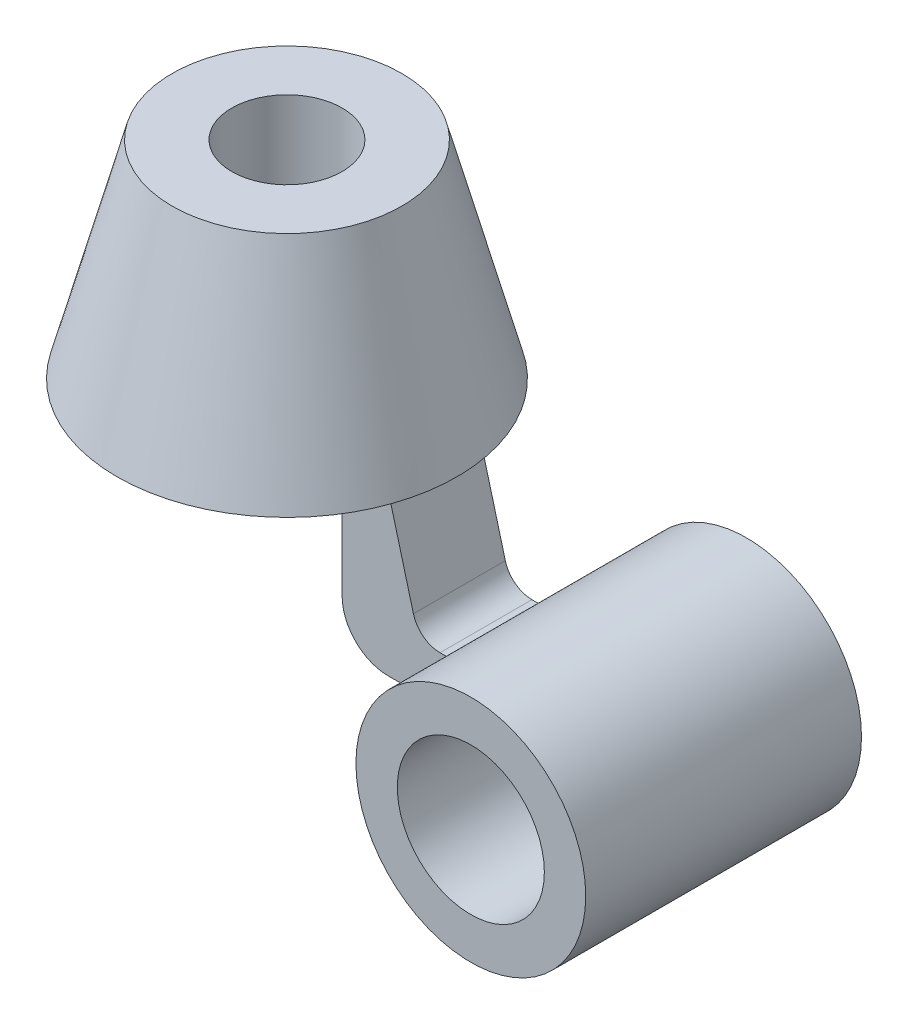
ISO-10303-21;
HEADER;
FILE_DESCRIPTION(('STEP AP214'),'2;1');
FILE_NAME('part.step','',(''),(''),'','','');
FILE_SCHEMA(('AUTOMOTIVE_DESIGN { 1 0 10303 214 1 1 1 1 }'));
ENDSEC;
DATA;
#1=APPLICATION_CONTEXT('core data for automotive mechanical design processes');
#2=APPLICATION_PROTOCOL_DEFINITION('international standard','automotive_design',2000,#1);
#3=PRODUCT_CONTEXT('',#1,'mechanical');
#4=PRODUCT('Part','Part','',(#3));
#5=PRODUCT_RELATED_PRODUCT_CATEGORY('part','',(#4));
#6=PRODUCT_DEFINITION_FORMATION('','',#4);
#7=PRODUCT_DEFINITION_CONTEXT('part definition',#1,'design');
#8=PRODUCT_DEFINITION('design','',#6,#7);
#9=PRODUCT_DEFINITION_SHAPE('','',#8);
#10=(LENGTH_UNIT() NAMED_UNIT(*) SI_UNIT(.MILLI.,.METRE.));
#11=(NAMED_UNIT(*) PLANE_ANGLE_UNIT() SI_UNIT($,.RADIAN.));
#12=(NAMED_UNIT(*) SI_UNIT($,.STERADIAN.) SOLID_ANGLE_UNIT());
#13=UNCERTAINTY_MEASURE_WITH_UNIT(LENGTH_MEASURE(1.E-05),#10,'distance_accuracy_value','');
#14=(GEOMETRIC_REPRESENTATION_CONTEXT(3) GLOBAL_UNCERTAINTY_ASSIGNED_CONTEXT((#13)) GLOBAL_UNIT_ASSIGNED_CONTEXT((#10,
#11,#12)) REPRESENTATION_CONTEXT('',''));
#15=CARTESIAN_POINT('',(0.,0.,0.));
#16=DIRECTION('',(0.,0.,1.));
#17=DIRECTION('',(1.,0.,0.));
#18=AXIS2_PLACEMENT_3D('',#15,#16,#17);
#19=CARTESIAN_POINT('',(22.,-35.,10.));
#20=DIRECTION('',(0.,1.,0.));
#21=DIRECTION('',(0.,0.,1.));
#22=AXIS2_PLACEMENT_3D('',#19,#20,#21);
#23=PLANE('',#22);
#24=DIRECTION('',(1.,0.,0.));
#25=VECTOR('',#24,1.);
#26=CARTESIAN_POINT('',(22.,-35.,10.));
#27=LINE('',#26,#25);
#28=CARTESIAN_POINT('',(32.,-35.,10.));
#29=VERTEX_POINT('',#28);
#30=CARTESIAN_POINT('',(45.,-35.,10.));
#31=VERTEX_POINT('',#30);
#32=EDGE_CURVE('E259',#29,#31,#27,.T.);
#33=ORIENTED_EDGE('',*,*,#32,.F.);
#34=DIRECTION('',(0.,0.,-1.));
#35=VECTOR('',#34,1.);
#36=CARTESIAN_POINT('',(32.,-35.,10.));
#37=LINE('',#36,#35);
#38=CARTESIAN_POINT('',(32.,-35.,-10.));
#39=VERTEX_POINT('',#38);
#40=EDGE_CURVE('E133',#29,#39,#37,.T.);
#41=ORIENTED_EDGE('',*,*,#40,.T.);
#42=DIRECTION('',(1.,0.,0.));
#43=VECTOR('',#42,1.);
#44=CARTESIAN_POINT('',(22.,-35.,-10.));
#45=LINE('',#44,#43);
#46=CARTESIAN_POINT('',(45.,-35.,-10.));
#47=VERTEX_POINT('',#46);
#48=EDGE_CURVE('E117',#39,#47,#45,.T.);
#49=ORIENTED_EDGE('',*,*,#48,.T.);
#50=DIRECTION('',(0.,0.,-1.));
#51=VECTOR('',#50,1.);
#52=CARTESIAN_POINT('',(45.,-35.,30.));
#53=LINE('',#52,#51);
#54=EDGE_CURVE('E126',#31,#47,#53,.T.);
#55=ORIENTED_EDGE('',*,*,#54,.F.);
#56=EDGE_LOOP('',(#33,#41,#49,#55));
#57=FACE_BOUND('',#56,.T.);
#58=ADVANCED_FACE('F45',(#57),#23,.F.);
#59=CARTESIAN_POINT('',(54.1887004621803,-25.,10.));
#60=DIRECTION('',(0.,-1.,0.));
#61=DIRECTION('',(1.,0.,0.));
#62=AXIS2_PLACEMENT_3D('',#59,#60,#61);
#63=PLANE('',#62);
#64=DIRECTION('',(-1.,0.,0.));
#65=VECTOR('',#64,1.);
#66=CARTESIAN_POINT('',(54.1887004621803,-25.,-10.));
#67=LINE('',#66,#65);
#68=CARTESIAN_POINT('',(47.0871215252208,-25.,-10.));
#69=VERTEX_POINT('',#68);
#70=CARTESIAN_POINT('',(43.3026917386517,-25.,-10.));
#71=VERTEX_POINT('',#70);
#72=EDGE_CURVE('E108',#69,#71,#67,.T.);
#73=ORIENTED_EDGE('',*,*,#72,.T.);
#74=DIRECTION('',(0.,0.,-1.));
#75=VECTOR('',#74,1.);
#76=CARTESIAN_POINT('',(43.3026917386517,-25.,10.));
#77=LINE('',#76,#75);
#78=CARTESIAN_POINT('',(43.3026917386517,-25.,10.));
#79=VERTEX_POINT('',#78);
#80=EDGE_CURVE('E61',#71,#79,#77,.F.);
#81=ORIENTED_EDGE('',*,*,#80,.T.);
#82=DIRECTION('',(-1.,0.,0.));
#83=VECTOR('',#82,1.);
#84=CARTESIAN_POINT('',(54.1887004621803,-25.,10.));
#85=LINE('',#84,#83);
#86=CARTESIAN_POINT('',(47.0871215252208,-25.,10.));
#87=VERTEX_POINT('',#86);
#88=EDGE_CURVE('E122',#87,#79,#85,.T.);
#89=ORIENTED_EDGE('',*,*,#88,.F.);
#90=DIRECTION('',(0.,0.,-1.));
#91=VECTOR('',#90,1.);
#92=CARTESIAN_POINT('',(47.0871215252208,-25.,30.));
#93=LINE('',#92,#91);
#94=EDGE_CURVE('E120',#69,#87,#93,.F.);
#95=ORIENTED_EDGE('',*,*,#94,.F.);
#96=EDGE_LOOP('',(#73,#81,#89,#95));
#97=FACE_BOUND('',#96,.T.);
#98=ADVANCED_FACE('F121',(#97),#63,.F.);
#99=CARTESIAN_POINT('',(0.,0.,0.));
#100=DIRECTION('',(0.,1.,0.));
#101=DIRECTION('',(0.,0.,1.));
#102=AXIS2_PLACEMENT_3D('',#99,#100,#101);
#103=PLANE('',#102);
#104=CARTESIAN_POINT('',(0.,0.,0.));
#105=DIRECTION('',(0.,1.,0.));
#106=DIRECTION('',(0.,0.,1.));
#107=AXIS2_PLACEMENT_3D('',#104,#105,#106);
#108=CIRCLE('',#107,12.);
#109=CARTESIAN_POINT('',(0.,0.,12.));
#110=VERTEX_POINT('',#109);
#111=EDGE_CURVE('E233',#110,#110,#108,.T.);
#112=ORIENTED_EDGE('',*,*,#111,.T.);
#113=EDGE_LOOP('',(#112));
#114=FACE_BOUND('',#113,.T.);
#115=DIRECTION('',(0.,0.,-1.));
#116=VECTOR('',#115,1.);
#117=CARTESIAN_POINT('',(22.,0.,10.));
#118=LINE('',#117,#116);
#119=CARTESIAN_POINT('',(22.,0.,10.));
#120=VERTEX_POINT('',#119);
#121=CARTESIAN_POINT('',(22.,0.,-10.));
#122=VERTEX_POINT('',#121);
#123=EDGE_CURVE('E184',#120,#122,#118,.T.);
#124=ORIENTED_EDGE('',*,*,#123,.F.);
#125=DIRECTION('',(-1.,0.,0.));
#126=VECTOR('',#125,1.);
#127=CARTESIAN_POINT('',(32.,0.,10.));
#128=LINE('',#127,#126);
#129=CARTESIAN_POINT('',(32.,0.,10.));
#130=VERTEX_POINT('',#129);
#131=EDGE_CURVE('E173',#130,#120,#128,.T.);
#132=ORIENTED_EDGE('',*,*,#131,.F.);
#133=DIRECTION('',(0.,0.,-1.));
#134=VECTOR('',#133,1.);
#135=CARTESIAN_POINT('',(32.,0.,10.));
#136=LINE('',#135,#134);
#137=CARTESIAN_POINT('',(32.,0.,-10.));
#138=VERTEX_POINT('',#137);
#139=EDGE_CURVE('E181',#130,#138,#136,.T.);
#140=ORIENTED_EDGE('',*,*,#139,.T.);
#141=DIRECTION('',(-1.,0.,0.));
#142=VECTOR('',#141,1.);
#143=CARTESIAN_POINT('',(32.,0.,-10.));
#144=LINE('',#143,#142);
#145=EDGE_CURVE('E171',#138,#122,#144,.T.);
#146=ORIENTED_EDGE('',*,*,#145,.T.);
#147=EDGE_LOOP('',(#124,#132,#140,#146));
#148=FACE_BOUND('',#147,.T.);
#149=CARTESIAN_POINT('',(0.,0.,0.));
#150=DIRECTION('',(0.,1.,0.));
#151=DIRECTION('',(0.,0.,1.));
#152=AXIS2_PLACEMENT_3D('',#149,#150,#151);
#153=CIRCLE('',#152,37.);
#154=CARTESIAN_POINT('',(0.,0.,37.));
#155=VERTEX_POINT('',#154);
#156=EDGE_CURVE('E134',#155,#155,#153,.T.);
#157=ORIENTED_EDGE('',*,*,#156,.F.);
#158=EDGE_LOOP('',(#157));
#159=FACE_BOUND('',#158,.T.);
#160=ADVANCED_FACE('F196',(#114,#148,#159),#103,.F.);
#161=CARTESIAN_POINT('',(0.,0.,0.));
#162=DIRECTION('',(0.,-1.,0.));
#163=DIRECTION('',(0.,0.,-1.));
#164=AXIS2_PLACEMENT_3D('',#161,#162,#163);
#165=CONICAL_SURFACE('',#164,37.,0.260602391747341);
#166=CARTESIAN_POINT('',(0.,45.,0.));
#167=DIRECTION('',(0.,1.,0.));
#168=DIRECTION('',(0.,0.,1.));
#169=AXIS2_PLACEMENT_3D('',#166,#167,#168);
#170=CIRCLE('',#169,25.);
#171=CARTESIAN_POINT('',(0.,45.,25.));
#172=VERTEX_POINT('',#171);
#173=EDGE_CURVE('E142',#172,#172,#170,.T.);
#174=ORIENTED_EDGE('',*,*,#173,.F.);
#175=EDGE_LOOP('',(#174));
#176=FACE_BOUND('',#175,.T.);
#177=ORIENTED_EDGE('',*,*,#156,.T.);
#178=EDGE_LOOP('',(#177));
#179=FACE_BOUND('',#178,.T.);
#180=ADVANCED_FACE('F193',(#176,#179),#165,.T.);
#181=CARTESIAN_POINT('',(25.,45.,0.));
#182=DIRECTION('',(0.,-1.,0.));
#183=DIRECTION('',(0.,0.,-1.));
#184=AXIS2_PLACEMENT_3D('',#181,#182,#183);
#185=PLANE('',#184);
#186=CARTESIAN_POINT('',(0.,45.,0.));
#187=DIRECTION('',(0.,1.,0.));
#188=DIRECTION('',(0.,0.,1.));
#189=AXIS2_PLACEMENT_3D('',#186,#187,#188);
#190=CIRCLE('',#189,12.);
#191=CARTESIAN_POINT('',(0.,45.,12.));
#192=VERTEX_POINT('',#191);
#193=EDGE_CURVE('E230',#192,#192,#190,.T.);
#194=ORIENTED_EDGE('',*,*,#193,.F.);
#195=EDGE_LOOP('',(#194));
#196=FACE_BOUND('',#195,.T.);
#197=ORIENTED_EDGE('',*,*,#173,.T.);
#198=EDGE_LOOP('',(#197));
#199=FACE_BOUND('',#198,.T.);
#200=ADVANCED_FACE('F191',(#196,#199),#185,.F.);
#201=CARTESIAN_POINT('',(22.,0.,10.));
#202=DIRECTION('',(1.,0.,0.));
#203=DIRECTION('',(0.,1.,0.));
#204=AXIS2_PLACEMENT_3D('',#201,#202,#203);
#205=PLANE('',#204);
#206=DIRECTION('',(0.,-1.,0.));
#207=VECTOR('',#206,1.);
#208=CARTESIAN_POINT('',(22.,0.,-10.));
#209=LINE('',#208,#207);
#210=CARTESIAN_POINT('',(22.,-25.,-10.));
#211=VERTEX_POINT('',#210);
#212=EDGE_CURVE('E268',#122,#211,#209,.T.);
#213=ORIENTED_EDGE('',*,*,#212,.T.);
#214=DIRECTION('',(0.,0.,-1.));
#215=VECTOR('',#214,1.);
#216=CARTESIAN_POINT('',(22.,-25.,10.));
#217=LINE('',#216,#215);
#218=CARTESIAN_POINT('',(22.,-25.,10.));
#219=VERTEX_POINT('',#218);
#220=EDGE_CURVE('E148',#211,#219,#217,.F.);
#221=ORIENTED_EDGE('',*,*,#220,.T.);
#222=DIRECTION('',(0.,-1.,0.));
#223=VECTOR('',#222,1.);
#224=CARTESIAN_POINT('',(22.,0.,10.));
#225=LINE('',#224,#223);
#226=EDGE_CURVE('E177',#120,#219,#225,.T.);
#227=ORIENTED_EDGE('',*,*,#226,.F.);
#228=ORIENTED_EDGE('',*,*,#123,.T.);
#229=EDGE_LOOP('',(#213,#221,#227,#228));
#230=FACE_BOUND('',#229,.T.);
#231=ADVANCED_FACE('F221',(#230),#205,.F.);
#232=CARTESIAN_POINT('',(38.6987298107779,-25.,10.));
#233=DIRECTION('',(-0.96592582628907,-0.258819045102515,0.));
#234=DIRECTION('',(0.258819045102515,-0.96592582628907,0.));
#235=AXIS2_PLACEMENT_3D('',#232,#233,#234);
#236=PLANE('',#235);
#237=DIRECTION('',(-0.258819045102515,0.96592582628907,0.));
#238=VECTOR('',#237,1.);
#239=CARTESIAN_POINT('',(38.6987298107779,-25.,10.));
#240=LINE('',#239,#238);
#241=CARTESIAN_POINT('',(37.5071367809173,-20.5529142706151,10.));
#242=VERTEX_POINT('',#241);
#243=EDGE_CURVE('E166',#242,#130,#240,.T.);
#244=ORIENTED_EDGE('',*,*,#243,.F.);
#245=DIRECTION('',(0.,0.,-1.));
#246=VECTOR('',#245,1.);
#247=CARTESIAN_POINT('',(37.5071367809173,-20.5529142706151,-10.));
#248=LINE('',#247,#246);
#249=CARTESIAN_POINT('',(37.5071367809173,-20.5529142706151,-10.));
#250=VERTEX_POINT('',#249);
#251=EDGE_CURVE('E154',#242,#250,#248,.T.);
#252=ORIENTED_EDGE('',*,*,#251,.T.);
#253=DIRECTION('',(-0.258819045102515,0.96592582628907,0.));
#254=VECTOR('',#253,1.);
#255=CARTESIAN_POINT('',(38.6987298107779,-25.,-10.));
#256=LINE('',#255,#254);
#257=EDGE_CURVE('E116',#250,#138,#256,.T.);
#258=ORIENTED_EDGE('',*,*,#257,.T.);
#259=ORIENTED_EDGE('',*,*,#139,.F.);
#260=EDGE_LOOP('',(#244,#252,#258,#259));
#261=FACE_BOUND('',#260,.T.);
#262=ADVANCED_FACE('F163',(#261),#236,.F.);
#263=CARTESIAN_POINT('',(0.,0.,10.));
#264=DIRECTION('',(0.,0.,1.));
#265=DIRECTION('',(1.,0.,0.));
#266=AXIS2_PLACEMENT_3D('',#263,#264,#265);
#267=PLANE('',#266);
#268=ORIENTED_EDGE('',*,*,#226,.T.);
#269=CARTESIAN_POINT('',(32.,-25.,10.));
#270=DIRECTION('',(0.,0.,1.));
#271=DIRECTION('',(1.,0.,0.));
#272=AXIS2_PLACEMENT_3D('',#269,#270,#271);
#273=CIRCLE('',#272,10.);
#274=EDGE_CURVE('E151',#219,#29,#273,.T.);
#275=ORIENTED_EDGE('',*,*,#274,.T.);
#276=ORIENTED_EDGE('',*,*,#32,.T.);
#277=CARTESIAN_POINT('',(70.,-35.,10.));
#278=DIRECTION('',(0.,0.,1.));
#279=DIRECTION('',(1.,0.,0.));
#280=AXIS2_PLACEMENT_3D('',#277,#278,#279);
#281=CIRCLE('',#280,25.);
#282=EDGE_CURVE('E253',#31,#87,#281,.F.);
#283=ORIENTED_EDGE('',*,*,#282,.T.);
#284=ORIENTED_EDGE('',*,*,#88,.T.);
#285=CARTESIAN_POINT('',(43.3026917386517,-19.,10.));
#286=DIRECTION('',(0.,0.,1.));
#287=DIRECTION('',(1.,0.,0.));
#288=AXIS2_PLACEMENT_3D('',#285,#286,#287);
#289=CIRCLE('',#288,6.);
#290=EDGE_CURVE('E11',#79,#242,#289,.F.);
#291=ORIENTED_EDGE('',*,*,#290,.T.);
#292=ORIENTED_EDGE('',*,*,#243,.T.);
#293=ORIENTED_EDGE('',*,*,#131,.T.);
#294=EDGE_LOOP('',(#268,#275,#276,#283,#284,#291,#292,#293));
#295=FACE_BOUND('',#294,.T.);
#296=ADVANCED_FACE('F279',(#295),#267,.T.);
#297=CARTESIAN_POINT('',(0.,0.,-10.));
#298=DIRECTION('',(0.,0.,1.));
#299=DIRECTION('',(1.,0.,0.));
#300=AXIS2_PLACEMENT_3D('',#297,#298,#299);
#301=PLANE('',#300);
#302=ORIENTED_EDGE('',*,*,#48,.F.);
#303=CARTESIAN_POINT('',(32.,-25.,-10.));
#304=DIRECTION('',(0.,0.,1.));
#305=DIRECTION('',(1.,0.,0.));
#306=AXIS2_PLACEMENT_3D('',#303,#304,#305);
#307=CIRCLE('',#306,10.);
#308=EDGE_CURVE('E139',#39,#211,#307,.F.);
#309=ORIENTED_EDGE('',*,*,#308,.T.);
#310=ORIENTED_EDGE('',*,*,#212,.F.);
#311=ORIENTED_EDGE('',*,*,#145,.F.);
#312=ORIENTED_EDGE('',*,*,#257,.F.);
#313=CARTESIAN_POINT('',(43.3026917386517,-19.,-10.));
#314=DIRECTION('',(0.,0.,1.));
#315=DIRECTION('',(1.,0.,0.));
#316=AXIS2_PLACEMENT_3D('',#313,#314,#315);
#317=CIRCLE('',#316,6.);
#318=EDGE_CURVE('E54',#250,#71,#317,.T.);
#319=ORIENTED_EDGE('',*,*,#318,.T.);
#320=ORIENTED_EDGE('',*,*,#72,.F.);
#321=CARTESIAN_POINT('',(70.,-35.,-10.));
#322=DIRECTION('',(0.,0.,1.));
#323=DIRECTION('',(1.,0.,0.));
#324=AXIS2_PLACEMENT_3D('',#321,#322,#323);
#325=CIRCLE('',#324,25.);
#326=EDGE_CURVE('E113',#47,#69,#325,.F.);
#327=ORIENTED_EDGE('',*,*,#326,.F.);
#328=EDGE_LOOP('',(#302,#309,#310,#311,#312,#319,#320,#327));
#329=FACE_BOUND('',#328,.T.);
#330=ADVANCED_FACE('F111',(#329),#301,.F.);
#331=CARTESIAN_POINT('',(70.,-35.,30.));
#332=DIRECTION('',(0.,0.,-1.));
#333=DIRECTION('',(-1.,0.,0.));
#334=AXIS2_PLACEMENT_3D('',#331,#332,#333);
#335=CYLINDRICAL_SURFACE('',#334,25.);
#336=ORIENTED_EDGE('',*,*,#282,.F.);
#337=ORIENTED_EDGE('',*,*,#54,.T.);
#338=ORIENTED_EDGE('',*,*,#326,.T.);
#339=ORIENTED_EDGE('',*,*,#94,.T.);
#340=EDGE_LOOP('',(#336,#337,#338,#339));
#341=FACE_BOUND('',#340,.T.);
#342=CARTESIAN_POINT('',(70.,-35.,30.));
#343=DIRECTION('',(0.,0.,1.));
#344=DIRECTION('',(1.,0.,0.));
#345=AXIS2_PLACEMENT_3D('',#342,#343,#344);
#346=CIRCLE('',#345,25.);
#347=CARTESIAN_POINT('',(95.,-35.,30.));
#348=VERTEX_POINT('',#347);
#349=EDGE_CURVE('E127',#348,#348,#346,.T.);
#350=ORIENTED_EDGE('',*,*,#349,.F.);
#351=EDGE_LOOP('',(#350));
#352=FACE_BOUND('',#351,.T.);
#353=CARTESIAN_POINT('',(70.,-35.,-30.));
#354=DIRECTION('',(0.,0.,1.));
#355=DIRECTION('',(1.,0.,0.));
#356=AXIS2_PLACEMENT_3D('',#353,#354,#355);
#357=CIRCLE('',#356,25.);
#358=CARTESIAN_POINT('',(95.,-35.,-30.));
#359=VERTEX_POINT('',#358);
#360=EDGE_CURVE('E238',#359,#359,#357,.T.);
#361=ORIENTED_EDGE('',*,*,#360,.T.);
#362=EDGE_LOOP('',(#361));
#363=FACE_BOUND('',#362,.T.);
#364=ADVANCED_FACE('F129',(#341,#352,#363),#335,.T.);
#365=CARTESIAN_POINT('',(70.,-35.,30.));
#366=DIRECTION('',(0.,0.,1.));
#367=DIRECTION('',(1.,0.,0.));
#368=AXIS2_PLACEMENT_3D('',#365,#366,#367);
#369=PLANE('',#368);
#370=CARTESIAN_POINT('',(70.,-35.,30.));
#371=DIRECTION('',(0.,0.,1.));
#372=DIRECTION('',(1.,0.,0.));
#373=AXIS2_PLACEMENT_3D('',#370,#371,#372);
#374=CIRCLE('',#373,16.);
#375=CARTESIAN_POINT('',(86.,-35.,30.));
#376=VERTEX_POINT('',#375);
#377=EDGE_CURVE('E241',#376,#376,#374,.T.);
#378=ORIENTED_EDGE('',*,*,#377,.F.);
#379=EDGE_LOOP('',(#378));
#380=FACE_BOUND('',#379,.T.);
#381=ORIENTED_EDGE('',*,*,#349,.T.);
#382=EDGE_LOOP('',(#381));
#383=FACE_BOUND('',#382,.T.);
#384=ADVANCED_FACE('F292',(#380,#383),#369,.T.);
#385=CARTESIAN_POINT('',(70.,-35.,-30.));
#386=DIRECTION('',(0.,0.,1.));
#387=DIRECTION('',(1.,0.,0.));
#388=AXIS2_PLACEMENT_3D('',#385,#386,#387);
#389=PLANE('',#388);
#390=CARTESIAN_POINT('',(70.,-35.,-30.));
#391=DIRECTION('',(0.,0.,1.));
#392=DIRECTION('',(1.,0.,0.));
#393=AXIS2_PLACEMENT_3D('',#390,#391,#392);
#394=CIRCLE('',#393,16.);
#395=CARTESIAN_POINT('',(86.,-35.,-30.));
#396=VERTEX_POINT('',#395);
#397=EDGE_CURVE('E234',#396,#396,#394,.T.);
#398=ORIENTED_EDGE('',*,*,#397,.T.);
#399=EDGE_LOOP('',(#398));
#400=FACE_BOUND('',#399,.T.);
#401=ORIENTED_EDGE('',*,*,#360,.F.);
#402=EDGE_LOOP('',(#401));
#403=FACE_BOUND('',#402,.T.);
#404=ADVANCED_FACE('F288',(#400,#403),#389,.F.);
#405=CARTESIAN_POINT('',(32.,-25.,10.));
#406=DIRECTION('',(0.,0.,-1.));
#407=DIRECTION('',(-1.,0.,0.));
#408=AXIS2_PLACEMENT_3D('',#405,#406,#407);
#409=CYLINDRICAL_SURFACE('',#408,10.);
#410=ORIENTED_EDGE('',*,*,#274,.F.);
#411=ORIENTED_EDGE('',*,*,#220,.F.);
#412=ORIENTED_EDGE('',*,*,#308,.F.);
#413=ORIENTED_EDGE('',*,*,#40,.F.);
#414=EDGE_LOOP('',(#410,#411,#412,#413));
#415=FACE_BOUND('',#414,.T.);
#416=ADVANCED_FACE('F277',(#415),#409,.T.);
#417=CARTESIAN_POINT('',(43.3026917386517,-19.,10.));
#418=DIRECTION('',(0.,0.,1.));
#419=DIRECTION('',(1.,0.,0.));
#420=AXIS2_PLACEMENT_3D('',#417,#418,#419);
#421=CYLINDRICAL_SURFACE('',#420,6.);
#422=ORIENTED_EDGE('',*,*,#290,.F.);
#423=ORIENTED_EDGE('',*,*,#80,.F.);
#424=ORIENTED_EDGE('',*,*,#318,.F.);
#425=ORIENTED_EDGE('',*,*,#251,.F.);
#426=EDGE_LOOP('',(#422,#423,#424,#425));
#427=FACE_BOUND('',#426,.T.);
#428=ADVANCED_FACE('F47',(#427),#421,.F.);
#429=CARTESIAN_POINT('',(0.,45.,0.));
#430=DIRECTION('',(0.,1.,0.));
#431=DIRECTION('',(0.,0.,1.));
#432=AXIS2_PLACEMENT_3D('',#429,#430,#431);
#433=CYLINDRICAL_SURFACE('',#432,12.);
#434=ORIENTED_EDGE('',*,*,#193,.T.);
#435=EDGE_LOOP('',(#434));
#436=FACE_BOUND('',#435,.T.);
#437=ORIENTED_EDGE('',*,*,#111,.F.);
#438=EDGE_LOOP('',(#437));
#439=FACE_BOUND('',#438,.T.);
#440=ADVANCED_FACE('F281',(#436,#439),#433,.F.);
#441=CARTESIAN_POINT('',(70.,-35.,30.));
#442=DIRECTION('',(0.,0.,1.));
#443=DIRECTION('',(1.,0.,0.));
#444=AXIS2_PLACEMENT_3D('',#441,#442,#443);
#445=CYLINDRICAL_SURFACE('',#444,16.);
#446=ORIENTED_EDGE('',*,*,#377,.T.);
#447=EDGE_LOOP('',(#446));
#448=FACE_BOUND('',#447,.T.);
#449=ORIENTED_EDGE('',*,*,#397,.F.);
#450=EDGE_LOOP('',(#449));
#451=FACE_BOUND('',#450,.T.);
#452=ADVANCED_FACE('F285',(#448,#451),#445,.F.);
#453=CLOSED_SHELL('',(#58,#98,#160,#180,#200,#231,#262,#296,#330,#364,#384,#404,#416,#428,#440,#452));
#454=MANIFOLD_SOLID_BREP('B2',#453);
#455=ADVANCED_BREP_SHAPE_REPRESENTATION('',(#18,#454),#14);
#456=SHAPE_DEFINITION_REPRESENTATION(#9,#455);
ENDSEC;
END-ISO-10303-21;
